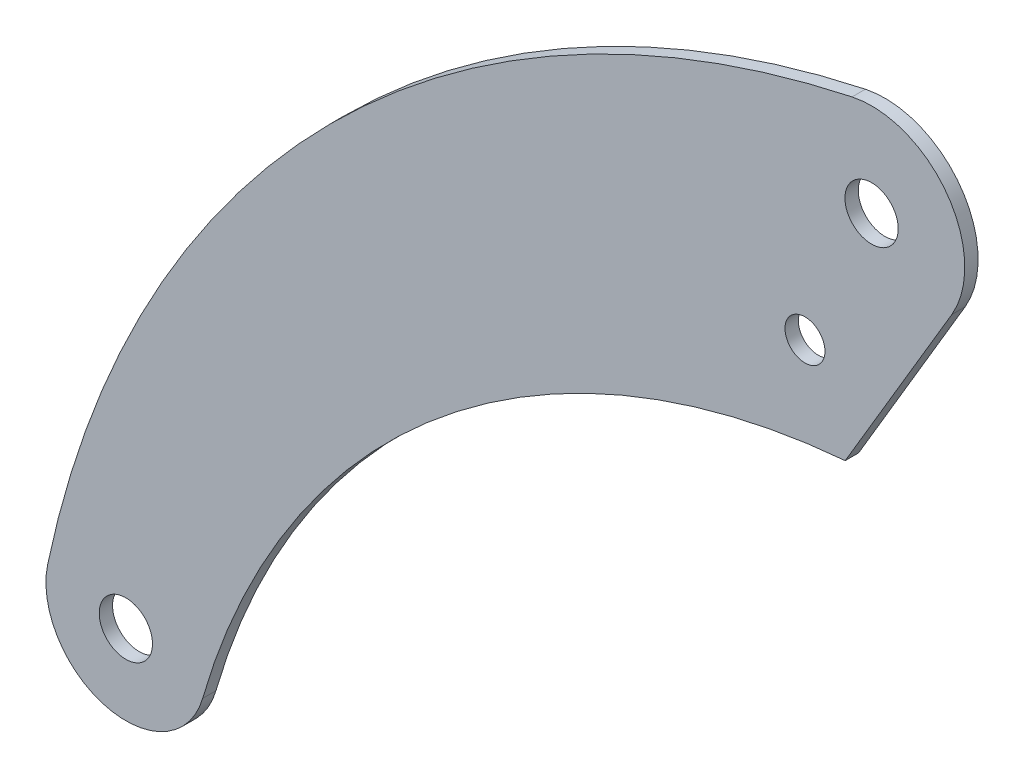
ISO-10303-21;
HEADER;
FILE_DESCRIPTION(('STEP AP214'),'2;1');
FILE_NAME('part.step','',(''),(''),'','','');
FILE_SCHEMA(('AUTOMOTIVE_DESIGN { 1 0 10303 214 1 1 1 1 }'));
ENDSEC;
DATA;
#1=APPLICATION_CONTEXT('core data for automotive mechanical design processes');
#2=APPLICATION_PROTOCOL_DEFINITION('international standard','automotive_design',2000,#1);
#3=PRODUCT_CONTEXT('',#1,'mechanical');
#4=PRODUCT('Part','Part','',(#3));
#5=PRODUCT_RELATED_PRODUCT_CATEGORY('part','',(#4));
#6=PRODUCT_DEFINITION_FORMATION('','',#4);
#7=PRODUCT_DEFINITION_CONTEXT('part definition',#1,'design');
#8=PRODUCT_DEFINITION('design','',#6,#7);
#9=PRODUCT_DEFINITION_SHAPE('','',#8);
#10=(LENGTH_UNIT() NAMED_UNIT(*) SI_UNIT(.MILLI.,.METRE.));
#11=(NAMED_UNIT(*) PLANE_ANGLE_UNIT() SI_UNIT($,.RADIAN.));
#12=(NAMED_UNIT(*) SI_UNIT($,.STERADIAN.) SOLID_ANGLE_UNIT());
#13=UNCERTAINTY_MEASURE_WITH_UNIT(LENGTH_MEASURE(1.E-05),#10,'distance_accuracy_value','');
#14=(GEOMETRIC_REPRESENTATION_CONTEXT(3) GLOBAL_UNCERTAINTY_ASSIGNED_CONTEXT((#13)) GLOBAL_UNIT_ASSIGNED_CONTEXT((#10,
#11,#12)) REPRESENTATION_CONTEXT('',''));
#15=CARTESIAN_POINT('',(0.,0.,0.));
#16=DIRECTION('',(0.,0.,1.));
#17=DIRECTION('',(1.,0.,0.));
#18=AXIS2_PLACEMENT_3D('',#15,#16,#17);
#19=CARTESIAN_POINT('',(26.1906733396149,-718.761649937565,5.));
#20=DIRECTION('',(0.,0.,1.));
#21=DIRECTION('',(1.,0.,0.));
#22=AXIS2_PLACEMENT_3D('',#19,#20,#21);
#23=PLANE('',#22);
#24=CARTESIAN_POINT('',(-50.,-107.266816037611,5.));
#25=DIRECTION('',(0.,0.,1.));
#26=DIRECTION('',(1.,0.,0.));
#27=AXIS2_PLACEMENT_3D('',#24,#25,#26);
#28=CIRCLE('',#27,15.);
#29=CARTESIAN_POINT('',(-35.,-107.266816037611,5.));
#30=VERTEX_POINT('',#29);
#31=EDGE_CURVE('E167',#30,#30,#28,.T.);
#32=ORIENTED_EDGE('',*,*,#31,.F.);
#33=EDGE_LOOP('',(#32));
#34=FACE_BOUND('',#33,.T.);
#35=CARTESIAN_POINT('',(26.1906733396149,-718.761649937565,5.));
#36=DIRECTION('',(0.,0.,-1.));
#37=DIRECTION('',(1.,0.,0.));
#38=AXIS2_PLACEMENT_3D('',#35,#36,#37);
#39=CIRCLE('',#38,550.);
#40=CARTESIAN_POINT('',(-502.341900982989,-566.599506551236,5.));
#41=VERTEX_POINT('',#40);
#42=CARTESIAN_POINT('',(-19.7795926456078,-170.686167321121,5.));
#43=VERTEX_POINT('',#42);
#44=EDGE_CURVE('E117',#41,#43,#39,.T.);
#45=ORIENTED_EDGE('',*,*,#44,.T.);
#46=DIRECTION('',(0.509802390301733,0.860291533634175,0.));
#47=VECTOR('',#46,1.);
#48=CARTESIAN_POINT('',(60.2204073543922,-35.6861673211213,5.));
#49=LINE('',#48,#47);
#50=CARTESIAN_POINT('',(60.2204073543923,-35.6861673211213,5.));
#51=VERTEX_POINT('',#50);
#52=EDGE_CURVE('E84',#43,#51,#49,.T.);
#53=ORIENTED_EDGE('',*,*,#52,.T.);
#54=CARTESIAN_POINT('',(0.,0.,5.));
#55=DIRECTION('',(0.,0.,1.));
#56=DIRECTION('',(1.,0.,0.));
#57=AXIS2_PLACEMENT_3D('',#54,#55,#56);
#58=CIRCLE('',#57,70.0000000000001);
#59=CARTESIAN_POINT('',(-14.6345840706821,68.4531149698693,5.));
#60=VERTEX_POINT('',#59);
#61=EDGE_CURVE('E88',#51,#60,#58,.T.);
#62=ORIENTED_EDGE('',*,*,#61,.T.);
#63=CARTESIAN_POINT('',(149.481823007681,-699.199674335093,5.));
#64=DIRECTION('',(0.,0.,1.));
#65=DIRECTION('',(1.,0.,0.));
#66=AXIS2_PLACEMENT_3D('',#63,#64,#65);
#67=CIRCLE('',#66,785.);
#68=CARTESIAN_POINT('',(-618.715737076498,-537.652440744682,5.));
#69=VERTEX_POINT('',#68);
#70=EDGE_CURVE('E92',#60,#69,#67,.T.);
#71=ORIENTED_EDGE('',*,*,#70,.T.);
#72=CARTESIAN_POINT('',(-560.,-550.,5.));
#73=DIRECTION('',(0.,0.,1.));
#74=DIRECTION('',(-1.,0.,0.));
#75=AXIS2_PLACEMENT_3D('',#72,#73,#74);
#76=CIRCLE('',#75,60.);
#77=EDGE_CURVE('E50',#69,#41,#76,.T.);
#78=ORIENTED_EDGE('',*,*,#77,.T.);
#79=EDGE_LOOP('',(#45,#53,#62,#71,#78));
#80=FACE_BOUND('',#79,.T.);
#81=CARTESIAN_POINT('',(0.,0.,5.));
#82=DIRECTION('',(0.,0.,1.));
#83=DIRECTION('',(1.,0.,0.));
#84=AXIS2_PLACEMENT_3D('',#81,#82,#83);
#85=CIRCLE('',#84,20.);
#86=CARTESIAN_POINT('',(20.,0.,5.));
#87=VERTEX_POINT('',#86);
#88=EDGE_CURVE('E112',#87,#87,#85,.T.);
#89=ORIENTED_EDGE('',*,*,#88,.F.);
#90=EDGE_LOOP('',(#89));
#91=FACE_BOUND('',#90,.T.);
#92=CARTESIAN_POINT('',(-560.,-550.,5.));
#93=DIRECTION('',(0.,0.,1.));
#94=DIRECTION('',(1.,0.,0.));
#95=AXIS2_PLACEMENT_3D('',#92,#93,#94);
#96=CIRCLE('',#95,20.0000000000001);
#97=CARTESIAN_POINT('',(-540.,-550.,5.));
#98=VERTEX_POINT('',#97);
#99=EDGE_CURVE('E158',#98,#98,#96,.T.);
#100=ORIENTED_EDGE('',*,*,#99,.F.);
#101=EDGE_LOOP('',(#100));
#102=FACE_BOUND('',#101,.T.);
#103=ADVANCED_FACE('F33',(#34,#80,#91,#102),#23,.T.);
#104=CARTESIAN_POINT('',(26.1906733396149,-718.761649937565,-5.));
#105=DIRECTION('',(0.,0.,1.));
#106=DIRECTION('',(1.,0.,0.));
#107=AXIS2_PLACEMENT_3D('',#104,#105,#106);
#108=PLANE('',#107);
#109=CARTESIAN_POINT('',(26.1906733396149,-718.761649937565,-5.));
#110=DIRECTION('',(0.,0.,-1.));
#111=DIRECTION('',(1.,0.,0.));
#112=AXIS2_PLACEMENT_3D('',#109,#110,#111);
#113=CIRCLE('',#112,550.);
#114=CARTESIAN_POINT('',(-502.341900982989,-566.599506551236,-5.));
#115=VERTEX_POINT('',#114);
#116=CARTESIAN_POINT('',(-19.7795926456078,-170.686167321121,-5.));
#117=VERTEX_POINT('',#116);
#118=EDGE_CURVE('E108',#115,#117,#113,.T.);
#119=ORIENTED_EDGE('',*,*,#118,.F.);
#120=CARTESIAN_POINT('',(-560.,-550.,-5.));
#121=DIRECTION('',(0.,0.,1.));
#122=DIRECTION('',(-1.,0.,0.));
#123=AXIS2_PLACEMENT_3D('',#120,#121,#122);
#124=CIRCLE('',#123,60.);
#125=CARTESIAN_POINT('',(-618.715737076498,-537.652440744682,-5.));
#126=VERTEX_POINT('',#125);
#127=EDGE_CURVE('E76',#126,#115,#124,.T.);
#128=ORIENTED_EDGE('',*,*,#127,.F.);
#129=CARTESIAN_POINT('',(149.481823007681,-699.199674335093,-5.));
#130=DIRECTION('',(0.,0.,1.));
#131=DIRECTION('',(1.,0.,0.));
#132=AXIS2_PLACEMENT_3D('',#129,#130,#131);
#133=CIRCLE('',#132,785.);
#134=CARTESIAN_POINT('',(-14.6345840706821,68.4531149698693,-5.));
#135=VERTEX_POINT('',#134);
#136=EDGE_CURVE('E70',#135,#126,#133,.T.);
#137=ORIENTED_EDGE('',*,*,#136,.F.);
#138=CARTESIAN_POINT('',(0.,0.,-5.));
#139=DIRECTION('',(0.,0.,1.));
#140=DIRECTION('',(1.,0.,0.));
#141=AXIS2_PLACEMENT_3D('',#138,#139,#140);
#142=CIRCLE('',#141,70.0000000000001);
#143=CARTESIAN_POINT('',(60.2204073543923,-35.6861673211213,-5.));
#144=VERTEX_POINT('',#143);
#145=EDGE_CURVE('E99',#144,#135,#142,.T.);
#146=ORIENTED_EDGE('',*,*,#145,.F.);
#147=DIRECTION('',(0.509802390301733,0.860291533634175,0.));
#148=VECTOR('',#147,1.);
#149=CARTESIAN_POINT('',(60.2204073543922,-35.6861673211213,-5.));
#150=LINE('',#149,#148);
#151=EDGE_CURVE('E111',#117,#144,#150,.T.);
#152=ORIENTED_EDGE('',*,*,#151,.F.);
#153=EDGE_LOOP('',(#119,#128,#137,#146,#152));
#154=FACE_BOUND('',#153,.T.);
#155=CARTESIAN_POINT('',(0.,0.,-5.));
#156=DIRECTION('',(0.,0.,1.));
#157=DIRECTION('',(1.,0.,0.));
#158=AXIS2_PLACEMENT_3D('',#155,#156,#157);
#159=CIRCLE('',#158,20.);
#160=CARTESIAN_POINT('',(20.,0.,-5.));
#161=VERTEX_POINT('',#160);
#162=EDGE_CURVE('E170',#161,#161,#159,.T.);
#163=ORIENTED_EDGE('',*,*,#162,.T.);
#164=EDGE_LOOP('',(#163));
#165=FACE_BOUND('',#164,.T.);
#166=CARTESIAN_POINT('',(-50.,-107.266816037611,-5.));
#167=DIRECTION('',(0.,0.,1.));
#168=DIRECTION('',(1.,0.,0.));
#169=AXIS2_PLACEMENT_3D('',#166,#167,#168);
#170=CIRCLE('',#169,15.);
#171=CARTESIAN_POINT('',(-35.,-107.266816037611,-5.));
#172=VERTEX_POINT('',#171);
#173=EDGE_CURVE('E164',#172,#172,#170,.T.);
#174=ORIENTED_EDGE('',*,*,#173,.T.);
#175=EDGE_LOOP('',(#174));
#176=FACE_BOUND('',#175,.T.);
#177=CARTESIAN_POINT('',(-560.,-550.,-5.));
#178=DIRECTION('',(0.,0.,1.));
#179=DIRECTION('',(1.,0.,0.));
#180=AXIS2_PLACEMENT_3D('',#177,#178,#179);
#181=CIRCLE('',#180,20.0000000000001);
#182=CARTESIAN_POINT('',(-540.,-550.,-5.));
#183=VERTEX_POINT('',#182);
#184=EDGE_CURVE('E161',#183,#183,#181,.T.);
#185=ORIENTED_EDGE('',*,*,#184,.T.);
#186=EDGE_LOOP('',(#185));
#187=FACE_BOUND('',#186,.T.);
#188=ADVANCED_FACE('F121',(#154,#165,#176,#187),#108,.F.);
#189=CARTESIAN_POINT('',(26.1906733396149,-718.761649937565,5.));
#190=DIRECTION('',(0.,0.,-1.));
#191=DIRECTION('',(-1.,0.,0.));
#192=AXIS2_PLACEMENT_3D('',#189,#190,#191);
#193=CYLINDRICAL_SURFACE('',#192,550.);
#194=ORIENTED_EDGE('',*,*,#118,.T.);
#195=DIRECTION('',(0.,0.,-1.));
#196=VECTOR('',#195,1.);
#197=CARTESIAN_POINT('',(-19.7795926456078,-170.686167321121,5.));
#198=LINE('',#197,#196);
#199=EDGE_CURVE('E11',#43,#117,#198,.T.);
#200=ORIENTED_EDGE('',*,*,#199,.F.);
#201=ORIENTED_EDGE('',*,*,#44,.F.);
#202=DIRECTION('',(0.,0.,-1.));
#203=VECTOR('',#202,1.);
#204=CARTESIAN_POINT('',(-502.341900982989,-566.599506551236,5.));
#205=LINE('',#204,#203);
#206=EDGE_CURVE('E104',#41,#115,#205,.T.);
#207=ORIENTED_EDGE('',*,*,#206,.T.);
#208=EDGE_LOOP('',(#194,#200,#201,#207));
#209=FACE_BOUND('',#208,.T.);
#210=ADVANCED_FACE('F35',(#209),#193,.F.);
#211=CARTESIAN_POINT('',(60.2204073543922,-35.6861673211213,5.));
#212=DIRECTION('',(-0.860291533634175,0.509802390301733,0.));
#213=DIRECTION('',(-0.509802390301733,-0.860291533634175,0.));
#214=AXIS2_PLACEMENT_3D('',#211,#212,#213);
#215=PLANE('',#214);
#216=ORIENTED_EDGE('',*,*,#151,.T.);
#217=DIRECTION('',(0.,0.,-1.));
#218=VECTOR('',#217,1.);
#219=CARTESIAN_POINT('',(60.2204073543923,-35.6861673211213,5.));
#220=LINE('',#219,#218);
#221=EDGE_CURVE('E42',#51,#144,#220,.T.);
#222=ORIENTED_EDGE('',*,*,#221,.F.);
#223=ORIENTED_EDGE('',*,*,#52,.F.);
#224=ORIENTED_EDGE('',*,*,#199,.T.);
#225=EDGE_LOOP('',(#216,#222,#223,#224));
#226=FACE_BOUND('',#225,.T.);
#227=ADVANCED_FACE('F211',(#226),#215,.F.);
#228=CARTESIAN_POINT('',(0.,0.,5.));
#229=DIRECTION('',(0.,0.,-1.));
#230=DIRECTION('',(-1.,0.,0.));
#231=AXIS2_PLACEMENT_3D('',#228,#229,#230);
#232=CYLINDRICAL_SURFACE('',#231,70.0000000000001);
#233=ORIENTED_EDGE('',*,*,#145,.T.);
#234=DIRECTION('',(0.,0.,-1.));
#235=VECTOR('',#234,1.);
#236=CARTESIAN_POINT('',(-14.6345840706821,68.4531149698693,5.));
#237=LINE('',#236,#235);
#238=EDGE_CURVE('E96',#60,#135,#237,.T.);
#239=ORIENTED_EDGE('',*,*,#238,.F.);
#240=ORIENTED_EDGE('',*,*,#61,.F.);
#241=ORIENTED_EDGE('',*,*,#221,.T.);
#242=EDGE_LOOP('',(#233,#239,#240,#241));
#243=FACE_BOUND('',#242,.T.);
#244=ADVANCED_FACE('F97',(#243),#232,.T.);
#245=CARTESIAN_POINT('',(149.481823007681,-699.199674335093,5.));
#246=DIRECTION('',(0.,0.,-1.));
#247=DIRECTION('',(-1.,0.,0.));
#248=AXIS2_PLACEMENT_3D('',#245,#246,#247);
#249=CYLINDRICAL_SURFACE('',#248,785.);
#250=ORIENTED_EDGE('',*,*,#136,.T.);
#251=DIRECTION('',(0.,0.,-1.));
#252=VECTOR('',#251,1.);
#253=CARTESIAN_POINT('',(-618.715737076498,-537.652440744682,5.));
#254=LINE('',#253,#252);
#255=EDGE_CURVE('E100',#69,#126,#254,.T.);
#256=ORIENTED_EDGE('',*,*,#255,.F.);
#257=ORIENTED_EDGE('',*,*,#70,.F.);
#258=ORIENTED_EDGE('',*,*,#238,.T.);
#259=EDGE_LOOP('',(#250,#256,#257,#258));
#260=FACE_BOUND('',#259,.T.);
#261=ADVANCED_FACE('F102',(#260),#249,.T.);
#262=CARTESIAN_POINT('',(-560.,-550.,5.));
#263=DIRECTION('',(0.,0.,-1.));
#264=DIRECTION('',(-1.,0.,0.));
#265=AXIS2_PLACEMENT_3D('',#262,#263,#264);
#266=CYLINDRICAL_SURFACE('',#265,60.);
#267=ORIENTED_EDGE('',*,*,#127,.T.);
#268=ORIENTED_EDGE('',*,*,#206,.F.);
#269=ORIENTED_EDGE('',*,*,#77,.F.);
#270=ORIENTED_EDGE('',*,*,#255,.T.);
#271=EDGE_LOOP('',(#267,#268,#269,#270));
#272=FACE_BOUND('',#271,.T.);
#273=ADVANCED_FACE('F126',(#272),#266,.T.);
#274=CARTESIAN_POINT('',(0.,0.,5.));
#275=DIRECTION('',(0.,0.,-1.));
#276=DIRECTION('',(-1.,0.,0.));
#277=AXIS2_PLACEMENT_3D('',#274,#275,#276);
#278=CYLINDRICAL_SURFACE('',#277,20.);
#279=ORIENTED_EDGE('',*,*,#88,.T.);
#280=EDGE_LOOP('',(#279));
#281=FACE_BOUND('',#280,.T.);
#282=ORIENTED_EDGE('',*,*,#162,.F.);
#283=EDGE_LOOP('',(#282));
#284=FACE_BOUND('',#283,.T.);
#285=ADVANCED_FACE('F128',(#281,#284),#278,.F.);
#286=CARTESIAN_POINT('',(-50.,-107.266816037611,5.));
#287=DIRECTION('',(0.,0.,-1.));
#288=DIRECTION('',(-1.,0.,0.));
#289=AXIS2_PLACEMENT_3D('',#286,#287,#288);
#290=CYLINDRICAL_SURFACE('',#289,15.);
#291=ORIENTED_EDGE('',*,*,#31,.T.);
#292=EDGE_LOOP('',(#291));
#293=FACE_BOUND('',#292,.T.);
#294=ORIENTED_EDGE('',*,*,#173,.F.);
#295=EDGE_LOOP('',(#294));
#296=FACE_BOUND('',#295,.T.);
#297=ADVANCED_FACE('F134',(#293,#296),#290,.F.);
#298=CARTESIAN_POINT('',(-560.,-550.,5.));
#299=DIRECTION('',(0.,0.,-1.));
#300=DIRECTION('',(-1.,0.,0.));
#301=AXIS2_PLACEMENT_3D('',#298,#299,#300);
#302=CYLINDRICAL_SURFACE('',#301,20.0000000000001);
#303=ORIENTED_EDGE('',*,*,#99,.T.);
#304=EDGE_LOOP('',(#303));
#305=FACE_BOUND('',#304,.T.);
#306=ORIENTED_EDGE('',*,*,#184,.F.);
#307=EDGE_LOOP('',(#306));
#308=FACE_BOUND('',#307,.T.);
#309=ADVANCED_FACE('F149',(#305,#308),#302,.F.);
#310=CLOSED_SHELL('',(#103,#188,#210,#227,#244,#261,#273,#285,#297,#309));
#311=MANIFOLD_SOLID_BREP('B2',#310);
#312=ADVANCED_BREP_SHAPE_REPRESENTATION('',(#18,#311),#14);
#313=SHAPE_DEFINITION_REPRESENTATION(#9,#312);
ENDSEC;
END-ISO-10303-21;
